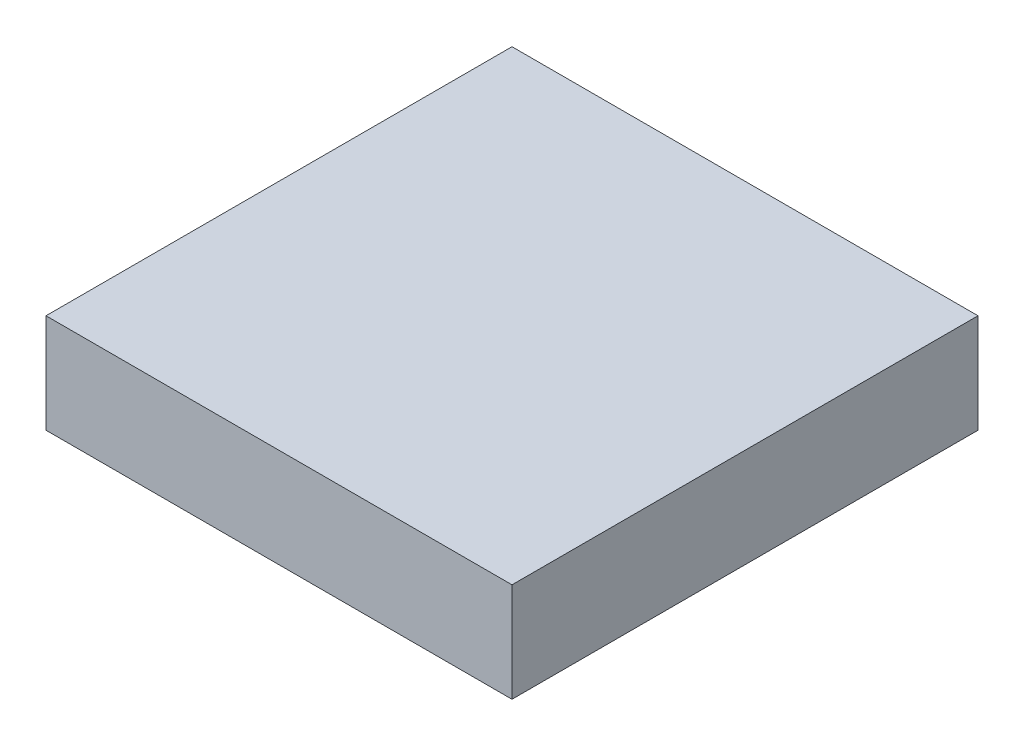
ISO-10303-21;
HEADER;
FILE_DESCRIPTION(('STEP AP214'),'2;1');
FILE_NAME('part.step','',(''),(''),'','','');
FILE_SCHEMA(('AUTOMOTIVE_DESIGN { 1 0 10303 214 1 1 1 1 }'));
ENDSEC;
DATA;
#1=APPLICATION_CONTEXT('core data for automotive mechanical design processes');
#2=APPLICATION_PROTOCOL_DEFINITION('international standard','automotive_design',2000,#1);
#3=PRODUCT_CONTEXT('',#1,'mechanical');
#4=PRODUCT('Part','Part','',(#3));
#5=PRODUCT_RELATED_PRODUCT_CATEGORY('part','',(#4));
#6=PRODUCT_DEFINITION_FORMATION('','',#4);
#7=PRODUCT_DEFINITION_CONTEXT('part definition',#1,'design');
#8=PRODUCT_DEFINITION('design','',#6,#7);
#9=PRODUCT_DEFINITION_SHAPE('','',#8);
#10=(LENGTH_UNIT() NAMED_UNIT(*) SI_UNIT(.MILLI.,.METRE.));
#11=(NAMED_UNIT(*) PLANE_ANGLE_UNIT() SI_UNIT($,.RADIAN.));
#12=(NAMED_UNIT(*) SI_UNIT($,.STERADIAN.) SOLID_ANGLE_UNIT());
#13=UNCERTAINTY_MEASURE_WITH_UNIT(LENGTH_MEASURE(1.E-05),#10,'distance_accuracy_value','');
#14=(GEOMETRIC_REPRESENTATION_CONTEXT(3) GLOBAL_UNCERTAINTY_ASSIGNED_CONTEXT((#13)) GLOBAL_UNIT_ASSIGNED_CONTEXT((#10,
#11,#12)) REPRESENTATION_CONTEXT('',''));
#15=CARTESIAN_POINT('',(0.,0.,0.));
#16=DIRECTION('',(0.,0.,1.));
#17=DIRECTION('',(1.,0.,0.));
#18=AXIS2_PLACEMENT_3D('',#15,#16,#17);
#19=CARTESIAN_POINT('',(-39.618396222575,25.4,-101.926783625731));
#20=DIRECTION('',(1.,0.,0.));
#21=DIRECTION('',(0.,0.,-1.));
#22=AXIS2_PLACEMENT_3D('',#19,#20,#21);
#23=PLANE('',#22);
#24=DIRECTION('',(0.,0.,1.));
#25=VECTOR('',#24,1.);
#26=CARTESIAN_POINT('',(-39.618396222575,0.,-101.926783625731));
#27=LINE('',#26,#25);
#28=CARTESIAN_POINT('',(-39.618396222575,0.,-101.926783625731));
#29=VERTEX_POINT('',#28);
#30=CARTESIAN_POINT('',(-39.618396222575,0.,17.453216374269));
#31=VERTEX_POINT('',#30);
#32=EDGE_CURVE('E96',#29,#31,#27,.T.);
#33=ORIENTED_EDGE('',*,*,#32,.T.);
#34=DIRECTION('',(0.,-1.,0.));
#35=VECTOR('',#34,1.);
#36=CARTESIAN_POINT('',(-39.618396222575,25.4,17.453216374269));
#37=LINE('',#36,#35);
#38=CARTESIAN_POINT('',(-39.618396222575,25.4,17.453216374269));
#39=VERTEX_POINT('',#38);
#40=EDGE_CURVE('E11',#39,#31,#37,.T.);
#41=ORIENTED_EDGE('',*,*,#40,.F.);
#42=DIRECTION('',(0.,0.,1.));
#43=VECTOR('',#42,1.);
#44=CARTESIAN_POINT('',(-39.618396222575,25.4,-101.926783625731));
#45=LINE('',#44,#43);
#46=CARTESIAN_POINT('',(-39.618396222575,25.4,-101.926783625731));
#47=VERTEX_POINT('',#46);
#48=EDGE_CURVE('E84',#47,#39,#45,.T.);
#49=ORIENTED_EDGE('',*,*,#48,.F.);
#50=DIRECTION('',(0.,-1.,0.));
#51=VECTOR('',#50,1.);
#52=CARTESIAN_POINT('',(-39.618396222575,25.4,-101.926783625731));
#53=LINE('',#52,#51);
#54=EDGE_CURVE('E92',#47,#29,#53,.T.);
#55=ORIENTED_EDGE('',*,*,#54,.T.);
#56=EDGE_LOOP('',(#33,#41,#49,#55));
#57=FACE_BOUND('',#56,.T.);
#58=ADVANCED_FACE('F33',(#57),#23,.F.);
#59=CARTESIAN_POINT('',(-39.618396222575,25.4,17.453216374269));
#60=DIRECTION('',(0.,0.,-1.));
#61=DIRECTION('',(-1.,0.,0.));
#62=AXIS2_PLACEMENT_3D('',#59,#60,#61);
#63=PLANE('',#62);
#64=DIRECTION('',(1.,0.,0.));
#65=VECTOR('',#64,1.);
#66=CARTESIAN_POINT('',(-39.618396222575,0.,17.453216374269));
#67=LINE('',#66,#65);
#68=CARTESIAN_POINT('',(79.761603777425,0.,17.453216374269));
#69=VERTEX_POINT('',#68);
#70=EDGE_CURVE('E88',#31,#69,#67,.T.);
#71=ORIENTED_EDGE('',*,*,#70,.T.);
#72=DIRECTION('',(0.,-1.,0.));
#73=VECTOR('',#72,1.);
#74=CARTESIAN_POINT('',(79.761603777425,25.4,17.453216374269));
#75=LINE('',#74,#73);
#76=CARTESIAN_POINT('',(79.761603777425,25.4,17.453216374269));
#77=VERTEX_POINT('',#76);
#78=EDGE_CURVE('E41',#77,#69,#75,.T.);
#79=ORIENTED_EDGE('',*,*,#78,.F.);
#80=DIRECTION('',(1.,0.,0.));
#81=VECTOR('',#80,1.);
#82=CARTESIAN_POINT('',(-39.618396222575,25.4,17.453216374269));
#83=LINE('',#82,#81);
#84=EDGE_CURVE('E79',#39,#77,#83,.T.);
#85=ORIENTED_EDGE('',*,*,#84,.F.);
#86=ORIENTED_EDGE('',*,*,#40,.T.);
#87=EDGE_LOOP('',(#71,#79,#85,#86));
#88=FACE_BOUND('',#87,.T.);
#89=ADVANCED_FACE('F87',(#88),#63,.F.);
#90=CARTESIAN_POINT('',(79.761603777425,25.4,-101.926783625731));
#91=DIRECTION('',(-1.,0.,0.));
#92=DIRECTION('',(0.,0.,1.));
#93=AXIS2_PLACEMENT_3D('',#90,#91,#92);
#94=PLANE('',#93);
#95=DIRECTION('',(0.,0.,-1.));
#96=VECTOR('',#95,1.);
#97=CARTESIAN_POINT('',(79.761603777425,0.,-101.926783625731));
#98=LINE('',#97,#96);
#99=CARTESIAN_POINT('',(79.761603777425,0.,-101.926783625731));
#100=VERTEX_POINT('',#99);
#101=EDGE_CURVE('E66',#69,#100,#98,.T.);
#102=ORIENTED_EDGE('',*,*,#101,.T.);
#103=DIRECTION('',(0.,-1.,0.));
#104=VECTOR('',#103,1.);
#105=CARTESIAN_POINT('',(79.761603777425,25.4,-101.926783625731));
#106=LINE('',#105,#104);
#107=CARTESIAN_POINT('',(79.761603777425,25.4,-101.926783625731));
#108=VERTEX_POINT('',#107);
#109=EDGE_CURVE('E89',#108,#100,#106,.T.);
#110=ORIENTED_EDGE('',*,*,#109,.F.);
#111=DIRECTION('',(0.,0.,-1.));
#112=VECTOR('',#111,1.);
#113=CARTESIAN_POINT('',(79.761603777425,25.4,-101.926783625731));
#114=LINE('',#113,#112);
#115=EDGE_CURVE('E82',#77,#108,#114,.T.);
#116=ORIENTED_EDGE('',*,*,#115,.F.);
#117=ORIENTED_EDGE('',*,*,#78,.T.);
#118=EDGE_LOOP('',(#102,#110,#116,#117));
#119=FACE_BOUND('',#118,.T.);
#120=ADVANCED_FACE('F90',(#119),#94,.F.);
#121=CARTESIAN_POINT('',(-39.618396222575,25.4,-101.926783625731));
#122=DIRECTION('',(0.,0.,1.));
#123=DIRECTION('',(1.,0.,0.));
#124=AXIS2_PLACEMENT_3D('',#121,#122,#123);
#125=PLANE('',#124);
#126=DIRECTION('',(-1.,0.,0.));
#127=VECTOR('',#126,1.);
#128=CARTESIAN_POINT('',(-39.618396222575,0.,-101.926783625731));
#129=LINE('',#128,#127);
#130=EDGE_CURVE('E72',#100,#29,#129,.T.);
#131=ORIENTED_EDGE('',*,*,#130,.T.);
#132=ORIENTED_EDGE('',*,*,#54,.F.);
#133=DIRECTION('',(-1.,0.,0.));
#134=VECTOR('',#133,1.);
#135=CARTESIAN_POINT('',(-39.618396222575,25.4,-101.926783625731));
#136=LINE('',#135,#134);
#137=EDGE_CURVE('E49',#108,#47,#136,.T.);
#138=ORIENTED_EDGE('',*,*,#137,.F.);
#139=ORIENTED_EDGE('',*,*,#109,.T.);
#140=EDGE_LOOP('',(#131,#132,#138,#139));
#141=FACE_BOUND('',#140,.T.);
#142=ADVANCED_FACE('F103',(#141),#125,.F.);
#143=CARTESIAN_POINT('',(0.,25.4,0.));
#144=DIRECTION('',(0.,1.,0.));
#145=DIRECTION('',(0.,0.,1.));
#146=AXIS2_PLACEMENT_3D('',#143,#144,#145);
#147=PLANE('',#146);
#148=ORIENTED_EDGE('',*,*,#48,.T.);
#149=ORIENTED_EDGE('',*,*,#84,.T.);
#150=ORIENTED_EDGE('',*,*,#115,.T.);
#151=ORIENTED_EDGE('',*,*,#137,.T.);
#152=EDGE_LOOP('',(#148,#149,#150,#151));
#153=FACE_BOUND('',#152,.T.);
#154=ADVANCED_FACE('F80',(#153),#147,.T.);
#155=CARTESIAN_POINT('',(0.,0.,0.));
#156=DIRECTION('',(0.,1.,0.));
#157=DIRECTION('',(0.,0.,1.));
#158=AXIS2_PLACEMENT_3D('',#155,#156,#157);
#159=PLANE('',#158);
#160=ORIENTED_EDGE('',*,*,#32,.F.);
#161=ORIENTED_EDGE('',*,*,#130,.F.);
#162=ORIENTED_EDGE('',*,*,#101,.F.);
#163=ORIENTED_EDGE('',*,*,#70,.F.);
#164=EDGE_LOOP('',(#160,#161,#162,#163));
#165=FACE_BOUND('',#164,.T.);
#166=ADVANCED_FACE('F106',(#165),#159,.F.);
#167=CLOSED_SHELL('',(#58,#89,#120,#142,#154,#166));
#168=MANIFOLD_SOLID_BREP('B2',#167);
#169=ADVANCED_BREP_SHAPE_REPRESENTATION('',(#18,#168),#14);
#170=SHAPE_DEFINITION_REPRESENTATION(#9,#169);
ENDSEC;
END-ISO-10303-21;
